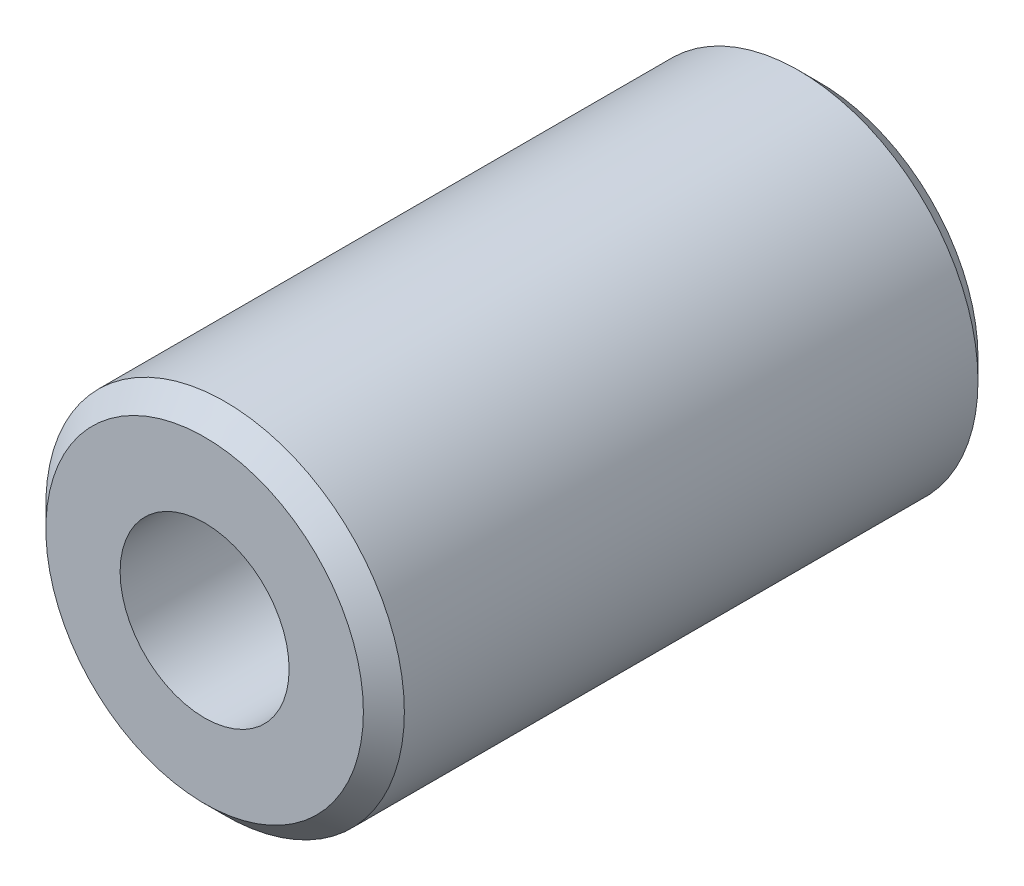
ISO-10303-21;
HEADER;
FILE_DESCRIPTION(('STEP AP214'),'2;1');
FILE_NAME('part.step','',(''),(''),'','','');
FILE_SCHEMA(('AUTOMOTIVE_DESIGN { 1 0 10303 214 1 1 1 1 }'));
ENDSEC;
DATA;
#1=APPLICATION_CONTEXT('core data for automotive mechanical design processes');
#2=APPLICATION_PROTOCOL_DEFINITION('international standard','automotive_design',2000,#1);
#3=PRODUCT_CONTEXT('',#1,'mechanical');
#4=PRODUCT('Part','Part','',(#3));
#5=PRODUCT_RELATED_PRODUCT_CATEGORY('part','',(#4));
#6=PRODUCT_DEFINITION_FORMATION('','',#4);
#7=PRODUCT_DEFINITION_CONTEXT('part definition',#1,'design');
#8=PRODUCT_DEFINITION('design','',#6,#7);
#9=PRODUCT_DEFINITION_SHAPE('','',#8);
#10=(LENGTH_UNIT() NAMED_UNIT(*) SI_UNIT(.MILLI.,.METRE.));
#11=(NAMED_UNIT(*) PLANE_ANGLE_UNIT() SI_UNIT($,.RADIAN.));
#12=(NAMED_UNIT(*) SI_UNIT($,.STERADIAN.) SOLID_ANGLE_UNIT());
#13=UNCERTAINTY_MEASURE_WITH_UNIT(LENGTH_MEASURE(1.E-05),#10,'distance_accuracy_value','');
#14=(GEOMETRIC_REPRESENTATION_CONTEXT(3) GLOBAL_UNCERTAINTY_ASSIGNED_CONTEXT((#13)) GLOBAL_UNIT_ASSIGNED_CONTEXT((#10,
#11,#12)) REPRESENTATION_CONTEXT('',''));
#15=CARTESIAN_POINT('',(0.,0.,0.));
#16=DIRECTION('',(0.,0.,1.));
#17=DIRECTION('',(1.,0.,0.));
#18=AXIS2_PLACEMENT_3D('',#15,#16,#17);
#19=CARTESIAN_POINT('',(0.,0.,12.));
#20=DIRECTION('',(0.,0.,1.));
#21=DIRECTION('',(1.,0.,0.));
#22=AXIS2_PLACEMENT_3D('',#19,#20,#21);
#23=PLANE('',#22);
#24=CARTESIAN_POINT('',(0.,0.,12.));
#25=DIRECTION('',(0.,0.,1.));
#26=DIRECTION('',(1.,0.,0.));
#27=AXIS2_PLACEMENT_3D('',#24,#25,#26);
#28=CIRCLE('',#27,3.1);
#29=CARTESIAN_POINT('',(3.1,0.,12.));
#30=VERTEX_POINT('',#29);
#31=EDGE_CURVE('E57',#30,#30,#28,.T.);
#32=ORIENTED_EDGE('',*,*,#31,.T.);
#33=EDGE_LOOP('',(#32));
#34=FACE_BOUND('',#33,.T.);
#35=CARTESIAN_POINT('',(0.,0.,12.));
#36=DIRECTION('',(0.,0.,1.));
#37=DIRECTION('',(1.,0.,0.));
#38=AXIS2_PLACEMENT_3D('',#35,#36,#37);
#39=CIRCLE('',#38,1.65);
#40=CARTESIAN_POINT('',(1.65,0.,12.));
#41=VERTEX_POINT('',#40);
#42=EDGE_CURVE('E62',#41,#41,#39,.T.);
#43=ORIENTED_EDGE('',*,*,#42,.F.);
#44=EDGE_LOOP('',(#43));
#45=FACE_BOUND('',#44,.T.);
#46=ADVANCED_FACE('F41',(#34,#45),#23,.T.);
#47=CARTESIAN_POINT('',(0.,0.,0.));
#48=DIRECTION('',(0.,0.,1.));
#49=DIRECTION('',(1.,0.,0.));
#50=AXIS2_PLACEMENT_3D('',#47,#48,#49);
#51=PLANE('',#50);
#52=CARTESIAN_POINT('',(0.,0.,0.));
#53=DIRECTION('',(0.,0.,1.));
#54=DIRECTION('',(1.,0.,0.));
#55=AXIS2_PLACEMENT_3D('',#52,#53,#54);
#56=CIRCLE('',#55,3.1);
#57=CARTESIAN_POINT('',(3.1,0.,0.));
#58=VERTEX_POINT('',#57);
#59=EDGE_CURVE('E10',#58,#58,#56,.F.);
#60=ORIENTED_EDGE('',*,*,#59,.T.);
#61=EDGE_LOOP('',(#60));
#62=FACE_BOUND('',#61,.T.);
#63=CARTESIAN_POINT('',(0.,0.,0.));
#64=DIRECTION('',(0.,0.,1.));
#65=DIRECTION('',(1.,0.,0.));
#66=AXIS2_PLACEMENT_3D('',#63,#64,#65);
#67=CIRCLE('',#66,1.65);
#68=CARTESIAN_POINT('',(1.65,0.,0.));
#69=VERTEX_POINT('',#68);
#70=EDGE_CURVE('E63',#69,#69,#67,.T.);
#71=ORIENTED_EDGE('',*,*,#70,.T.);
#72=EDGE_LOOP('',(#71));
#73=FACE_BOUND('',#72,.T.);
#74=ADVANCED_FACE('F73',(#62,#73),#51,.F.);
#75=CARTESIAN_POINT('',(0.,0.,12.));
#76=DIRECTION('',(0.,0.,-1.));
#77=DIRECTION('',(-1.,0.,0.));
#78=AXIS2_PLACEMENT_3D('',#75,#76,#77);
#79=CYLINDRICAL_SURFACE('',#78,3.5);
#80=CARTESIAN_POINT('',(0.,0.,11.6));
#81=DIRECTION('',(0.,0.,1.));
#82=DIRECTION('',(1.,0.,0.));
#83=AXIS2_PLACEMENT_3D('',#80,#81,#82);
#84=CIRCLE('',#83,3.5);
#85=CARTESIAN_POINT('',(3.5,0.,11.6));
#86=VERTEX_POINT('',#85);
#87=EDGE_CURVE('E49',#86,#86,#84,.F.);
#88=ORIENTED_EDGE('',*,*,#87,.T.);
#89=EDGE_LOOP('',(#88));
#90=FACE_BOUND('',#89,.T.);
#91=CARTESIAN_POINT('',(0.,0.,0.399999999999999));
#92=DIRECTION('',(0.,0.,1.));
#93=DIRECTION('',(1.,0.,0.));
#94=AXIS2_PLACEMENT_3D('',#91,#92,#93);
#95=CIRCLE('',#94,3.5);
#96=CARTESIAN_POINT('',(3.5,0.,0.399999999999999));
#97=VERTEX_POINT('',#96);
#98=EDGE_CURVE('E53',#97,#97,#95,.T.);
#99=ORIENTED_EDGE('',*,*,#98,.T.);
#100=EDGE_LOOP('',(#99));
#101=FACE_BOUND('',#100,.T.);
#102=ADVANCED_FACE('F80',(#90,#101),#79,.T.);
#103=CARTESIAN_POINT('',(0.,0.,12.));
#104=DIRECTION('',(0.,0.,-1.));
#105=DIRECTION('',(-1.,0.,0.));
#106=AXIS2_PLACEMENT_3D('',#103,#104,#105);
#107=CYLINDRICAL_SURFACE('',#106,1.65);
#108=ORIENTED_EDGE('',*,*,#42,.T.);
#109=EDGE_LOOP('',(#108));
#110=FACE_BOUND('',#109,.T.);
#111=ORIENTED_EDGE('',*,*,#70,.F.);
#112=EDGE_LOOP('',(#111));
#113=FACE_BOUND('',#112,.T.);
#114=ADVANCED_FACE('F69',(#110,#113),#107,.F.);
#115=CARTESIAN_POINT('',(0.,0.,12.));
#116=DIRECTION('',(0.,0.,-1.));
#117=DIRECTION('',(-1.,0.,0.));
#118=AXIS2_PLACEMENT_3D('',#115,#116,#117);
#119=CONICAL_SURFACE('',#118,3.1,0.785398163397445);
#120=ORIENTED_EDGE('',*,*,#87,.F.);
#121=EDGE_LOOP('',(#120));
#122=FACE_BOUND('',#121,.T.);
#123=ORIENTED_EDGE('',*,*,#31,.F.);
#124=EDGE_LOOP('',(#123));
#125=FACE_BOUND('',#124,.T.);
#126=ADVANCED_FACE('F86',(#122,#125),#119,.T.);
#127=CARTESIAN_POINT('',(0.,0.,0.399999999999999));
#128=DIRECTION('',(0.,0.,1.));
#129=DIRECTION('',(1.,0.,0.));
#130=AXIS2_PLACEMENT_3D('',#127,#128,#129);
#131=CONICAL_SURFACE('',#130,3.5,0.785398163397449);
#132=CARTESIAN_POINT('',(3.1,0.,0.));
#133=CARTESIAN_POINT('',(3.10416666666667,0.,0.0041666666666666));
#134=CARTESIAN_POINT('',(3.10833333333333,0.,0.00833333333333326));
#135=CARTESIAN_POINT('',(3.11666666666667,0.,0.0166666666666666));
#136=CARTESIAN_POINT('',(3.12083333333333,0.,0.0208333333333332));
#137=CARTESIAN_POINT('',(3.12916666666667,0.,0.0291666666666666));
#138=CARTESIAN_POINT('',(3.13333333333333,0.,0.0333333333333332));
#139=CARTESIAN_POINT('',(3.14166666666667,0.,0.0416666666666666));
#140=CARTESIAN_POINT('',(3.14583333333333,0.,0.0458333333333332));
#141=CARTESIAN_POINT('',(3.15416666666667,0.,0.0541666666666665));
#142=CARTESIAN_POINT('',(3.15833333333333,0.,0.0583333333333332));
#143=CARTESIAN_POINT('',(3.16666666666667,0.,0.0666666666666665));
#144=CARTESIAN_POINT('',(3.17083333333333,0.,0.0708333333333332));
#145=CARTESIAN_POINT('',(3.17916666666667,0.,0.0791666666666665));
#146=CARTESIAN_POINT('',(3.18333333333333,0.,0.0833333333333331));
#147=CARTESIAN_POINT('',(3.19166666666667,0.,0.0916666666666665));
#148=CARTESIAN_POINT('',(3.19583333333333,0.,0.0958333333333331));
#149=CARTESIAN_POINT('',(3.20416666666667,0.,0.104166666666666));
#150=CARTESIAN_POINT('',(3.20833333333333,0.,0.108333333333333));
#151=CARTESIAN_POINT('',(3.21666666666667,0.,0.116666666666666));
#152=CARTESIAN_POINT('',(3.22083333333333,0.,0.120833333333333));
#153=CARTESIAN_POINT('',(3.22916666666667,0.,0.129166666666666));
#154=CARTESIAN_POINT('',(3.23333333333333,0.,0.133333333333333));
#155=CARTESIAN_POINT('',(3.24166666666667,0.,0.141666666666666));
#156=CARTESIAN_POINT('',(3.24583333333333,0.,0.145833333333333));
#157=CARTESIAN_POINT('',(3.25416666666667,0.,0.154166666666666));
#158=CARTESIAN_POINT('',(3.25833333333333,0.,0.158333333333333));
#159=CARTESIAN_POINT('',(3.26666666666667,0.,0.166666666666666));
#160=CARTESIAN_POINT('',(3.27083333333333,0.,0.170833333333333));
#161=CARTESIAN_POINT('',(3.27916666666667,0.,0.179166666666666));
#162=CARTESIAN_POINT('',(3.28333333333333,0.,0.183333333333333));
#163=CARTESIAN_POINT('',(3.29166666666667,0.,0.191666666666666));
#164=CARTESIAN_POINT('',(3.29583333333333,0.,0.195833333333333));
#165=CARTESIAN_POINT('',(3.30416666666667,0.,0.204166666666666));
#166=CARTESIAN_POINT('',(3.30833333333333,0.,0.208333333333333));
#167=CARTESIAN_POINT('',(3.31666666666667,0.,0.216666666666666));
#168=CARTESIAN_POINT('',(3.32083333333333,0.,0.220833333333333));
#169=CARTESIAN_POINT('',(3.32916666666667,0.,0.229166666666666));
#170=CARTESIAN_POINT('',(3.33333333333333,0.,0.233333333333333));
#171=CARTESIAN_POINT('',(3.34166666666667,0.,0.241666666666666));
#172=CARTESIAN_POINT('',(3.34583333333333,0.,0.245833333333333));
#173=CARTESIAN_POINT('',(3.35416666666667,0.,0.254166666666666));
#174=CARTESIAN_POINT('',(3.35833333333333,0.,0.258333333333333));
#175=CARTESIAN_POINT('',(3.36666666666667,0.,0.266666666666666));
#176=CARTESIAN_POINT('',(3.37083333333333,0.,0.270833333333333));
#177=CARTESIAN_POINT('',(3.37916666666667,0.,0.279166666666666));
#178=CARTESIAN_POINT('',(3.38333333333333,0.,0.283333333333333));
#179=CARTESIAN_POINT('',(3.39166666666667,0.,0.291666666666666));
#180=CARTESIAN_POINT('',(3.39583333333333,0.,0.295833333333333));
#181=CARTESIAN_POINT('',(3.40416666666667,0.,0.304166666666666));
#182=CARTESIAN_POINT('',(3.40833333333333,0.,0.308333333333333));
#183=CARTESIAN_POINT('',(3.41666666666667,0.,0.316666666666666));
#184=CARTESIAN_POINT('',(3.42083333333333,0.,0.320833333333333));
#185=CARTESIAN_POINT('',(3.42916666666667,0.,0.329166666666666));
#186=CARTESIAN_POINT('',(3.43333333333333,0.,0.333333333333333));
#187=CARTESIAN_POINT('',(3.44166666666667,0.,0.341666666666666));
#188=CARTESIAN_POINT('',(3.44583333333333,0.,0.345833333333333));
#189=CARTESIAN_POINT('',(3.45416666666667,0.,0.354166666666666));
#190=CARTESIAN_POINT('',(3.45833333333333,0.,0.358333333333333));
#191=CARTESIAN_POINT('',(3.46666666666667,0.,0.366666666666666));
#192=CARTESIAN_POINT('',(3.47083333333333,0.,0.370833333333333));
#193=CARTESIAN_POINT('',(3.47916666666667,0.,0.379166666666666));
#194=CARTESIAN_POINT('',(3.48333333333333,0.,0.383333333333333));
#195=CARTESIAN_POINT('',(3.49166666666667,0.,0.391666666666666));
#196=CARTESIAN_POINT('',(3.49583333333333,0.,0.395833333333333));
#197=CARTESIAN_POINT('',(3.5,0.,0.399999999999999));
#198=B_SPLINE_CURVE_WITH_KNOTS('',3,(#132,#133,#134,#135,#136,#137,#138,#139,#140,#141,#142,
#143,#144,#145,#146,#147,#148,#149,#150,#151,#152,#153,#154,#155,#156,#157,#158,#159,#160,#161,
#162,#163,#164,#165,#166,#167,#168,#169,#170,#171,#172,#173,#174,#175,#176,#177,#178,#179,#180,
#181,#182,#183,#184,#185,#186,#187,#188,#189,#190,#191,#192,#193,#194,#195,#196,#197),
.UNSPECIFIED.,.F.,.F.,(4,2,2,2,2,2,2,2,2,2,2,2,2,2,2,2,2,2,2,2,2,2,2,2,2,2,2,2,2,2,2,2,4),(0.,
0.0176776695296636,0.0353553390593272,0.0530330085889909,0.0707106781186545,0.0883883476483184,
0.106066017177982,0.123743686707646,0.141421356237309,0.159099025766973,0.176776695296637,
0.194454364826301,0.212132034355964,0.229809703885628,0.247487373415291,0.265165042944955,
0.282842712474619,0.300520382004282,0.318198051533946,0.33587572106361,0.353553390593273,
0.371231060122937,0.388908729652601,0.406586399182264,0.424264068711928,0.441941738241592,
0.459619407771255,0.477297077300919,0.494974746830583,0.512652416360246,0.53033008588991,
0.548007755419574,0.565685424949237),.UNSPECIFIED.);
#199=EDGE_CURVE('BSEAM44',#58,#97,#198,.T.);
#200=ORIENTED_EDGE('',*,*,#59,.F.);
#201=ORIENTED_EDGE('',*,*,#98,.F.);
#202=ORIENTED_EDGE('',*,*,#199,.T.);
#203=ORIENTED_EDGE('',*,*,#199,.F.);
#204=EDGE_LOOP('',(#200,#202,#201,#203));
#205=FACE_BOUND('',#204,.T.);
#206=ADVANCED_FACE('F44',(#205),#131,.T.);
#207=CLOSED_SHELL('',(#46,#74,#102,#114,#126,#206));
#208=MANIFOLD_SOLID_BREP('B2',#207);
#209=ADVANCED_BREP_SHAPE_REPRESENTATION('',(#18,#208),#14);
#210=SHAPE_DEFINITION_REPRESENTATION(#9,#209);
ENDSEC;
END-ISO-10303-21;
